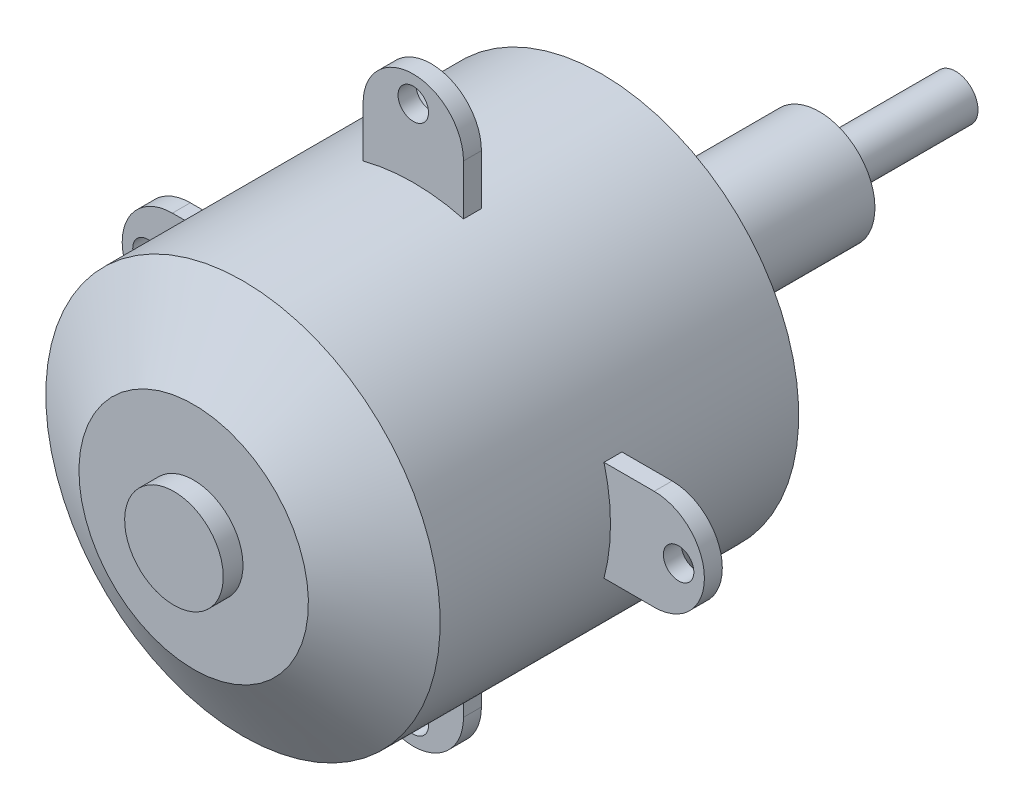
ISO-10303-21;
HEADER;
FILE_DESCRIPTION(('STEP AP214'),'2;1');
FILE_NAME('part.step','',(''),(''),'','','');
FILE_SCHEMA(('AUTOMOTIVE_DESIGN { 1 0 10303 214 1 1 1 1 }'));
ENDSEC;
DATA;
#1=APPLICATION_CONTEXT('core data for automotive mechanical design processes');
#2=APPLICATION_PROTOCOL_DEFINITION('international standard','automotive_design',2000,#1);
#3=PRODUCT_CONTEXT('',#1,'mechanical');
#4=PRODUCT('Part','Part','',(#3));
#5=PRODUCT_RELATED_PRODUCT_CATEGORY('part','',(#4));
#6=PRODUCT_DEFINITION_FORMATION('','',#4);
#7=PRODUCT_DEFINITION_CONTEXT('part definition',#1,'design');
#8=PRODUCT_DEFINITION('design','',#6,#7);
#9=PRODUCT_DEFINITION_SHAPE('','',#8);
#10=(LENGTH_UNIT() NAMED_UNIT(*) SI_UNIT(.MILLI.,.METRE.));
#11=(NAMED_UNIT(*) PLANE_ANGLE_UNIT() SI_UNIT($,.RADIAN.));
#12=(NAMED_UNIT(*) SI_UNIT($,.STERADIAN.) SOLID_ANGLE_UNIT());
#13=UNCERTAINTY_MEASURE_WITH_UNIT(LENGTH_MEASURE(1.E-05),#10,'distance_accuracy_value','');
#14=(GEOMETRIC_REPRESENTATION_CONTEXT(3) GLOBAL_UNCERTAINTY_ASSIGNED_CONTEXT((#13)) GLOBAL_UNIT_ASSIGNED_CONTEXT((#10,
#11,#12)) REPRESENTATION_CONTEXT('',''));
#15=CARTESIAN_POINT('',(0.,0.,0.));
#16=DIRECTION('',(0.,0.,1.));
#17=DIRECTION('',(1.,0.,0.));
#18=AXIS2_PLACEMENT_3D('',#15,#16,#17);
#19=CARTESIAN_POINT('',(0.,0.,16.1925));
#20=DIRECTION('',(0.,0.,1.));
#21=DIRECTION('',(0.,-1.,0.));
#22=AXIS2_PLACEMENT_3D('',#19,#20,#21);
#23=CYLINDRICAL_SURFACE('',#22,13.97);
#24=DIRECTION('',(0.,0.,1.));
#25=VECTOR('',#24,1.);
#26=CARTESIAN_POINT('',(3.556,-13.5098395253238,-0.635000000000005));
#27=LINE('',#26,#25);
#28=CARTESIAN_POINT('',(3.556,-13.5098395253238,-0.635000000000004));
#29=VERTEX_POINT('',#28);
#30=CARTESIAN_POINT('',(3.556,-13.5098395253238,0.634999999999995));
#31=VERTEX_POINT('',#30);
#32=EDGE_CURVE('E226',#29,#31,#27,.T.);
#33=ORIENTED_EDGE('',*,*,#32,.F.);
#34=CARTESIAN_POINT('',(0.,0.,-0.635));
#35=DIRECTION('',(0.,0.,1.));
#36=DIRECTION('',(-1.,0.,0.));
#37=AXIS2_PLACEMENT_3D('',#34,#35,#36);
#38=CIRCLE('',#37,13.97);
#39=CARTESIAN_POINT('',(-3.556,-13.5098395253238,-0.635000000000004));
#40=VERTEX_POINT('',#39);
#41=EDGE_CURVE('E219',#40,#29,#38,.T.);
#42=ORIENTED_EDGE('',*,*,#41,.F.);
#43=DIRECTION('',(0.,0.,1.));
#44=VECTOR('',#43,1.);
#45=CARTESIAN_POINT('',(-3.556,-13.5098395253238,-0.635000000000005));
#46=LINE('',#45,#44);
#47=CARTESIAN_POINT('',(-3.556,-13.5098395253238,0.634999999999995));
#48=VERTEX_POINT('',#47);
#49=EDGE_CURVE('E223',#40,#48,#46,.T.);
#50=ORIENTED_EDGE('',*,*,#49,.T.);
#51=CARTESIAN_POINT('',(0.,0.,0.635));
#52=DIRECTION('',(0.,0.,1.));
#53=DIRECTION('',(-1.,0.,0.));
#54=AXIS2_PLACEMENT_3D('',#51,#52,#53);
#55=CIRCLE('',#54,13.97);
#56=EDGE_CURVE('E206',#48,#31,#55,.T.);
#57=ORIENTED_EDGE('',*,*,#56,.T.);
#58=EDGE_LOOP('',(#33,#42,#50,#57));
#59=FACE_BOUND('',#58,.T.);
#60=DIRECTION('',(0.,0.,1.));
#61=VECTOR('',#60,1.);
#62=CARTESIAN_POINT('',(-3.556,13.5098395253238,-0.635));
#63=LINE('',#62,#61);
#64=CARTESIAN_POINT('',(-3.556,13.5098395253238,-0.635));
#65=VERTEX_POINT('',#64);
#66=CARTESIAN_POINT('',(-3.556,13.5098395253238,0.635));
#67=VERTEX_POINT('',#66);
#68=EDGE_CURVE('E300',#65,#67,#63,.T.);
#69=ORIENTED_EDGE('',*,*,#68,.F.);
#70=CARTESIAN_POINT('',(0.,0.,-0.635));
#71=DIRECTION('',(0.,0.,1.));
#72=DIRECTION('',(1.,0.,0.));
#73=AXIS2_PLACEMENT_3D('',#70,#71,#72);
#74=CIRCLE('',#73,13.97);
#75=CARTESIAN_POINT('',(3.556,13.5098395253238,-0.635));
#76=VERTEX_POINT('',#75);
#77=EDGE_CURVE('E293',#76,#65,#74,.T.);
#78=ORIENTED_EDGE('',*,*,#77,.F.);
#79=DIRECTION('',(0.,0.,1.));
#80=VECTOR('',#79,1.);
#81=CARTESIAN_POINT('',(3.556,13.5098395253238,-0.635));
#82=LINE('',#81,#80);
#83=CARTESIAN_POINT('',(3.556,13.5098395253238,0.635));
#84=VERTEX_POINT('',#83);
#85=EDGE_CURVE('E297',#76,#84,#82,.T.);
#86=ORIENTED_EDGE('',*,*,#85,.T.);
#87=CARTESIAN_POINT('',(0.,0.,0.635));
#88=DIRECTION('',(0.,0.,1.));
#89=DIRECTION('',(1.,0.,0.));
#90=AXIS2_PLACEMENT_3D('',#87,#88,#89);
#91=CIRCLE('',#90,13.97);
#92=EDGE_CURVE('E280',#84,#67,#91,.T.);
#93=ORIENTED_EDGE('',*,*,#92,.T.);
#94=EDGE_LOOP('',(#69,#78,#86,#93));
#95=FACE_BOUND('',#94,.T.);
#96=CARTESIAN_POINT('',(0.,0.,-12.6999999999999));
#97=DIRECTION('',(0.,0.,1.));
#98=DIRECTION('',(0.,-1.,0.));
#99=AXIS2_PLACEMENT_3D('',#96,#97,#98);
#100=CIRCLE('',#99,13.97);
#101=CARTESIAN_POINT('',(0.,-13.97,-12.6999999999999));
#102=VERTEX_POINT('',#101);
#103=EDGE_CURVE('E317',#102,#102,#100,.T.);
#104=ORIENTED_EDGE('',*,*,#103,.T.);
#105=EDGE_LOOP('',(#104));
#106=FACE_BOUND('',#105,.T.);
#107=CARTESIAN_POINT('',(0.,0.,12.7));
#108=DIRECTION('',(0.,0.,1.));
#109=DIRECTION('',(0.,-1.,0.));
#110=AXIS2_PLACEMENT_3D('',#107,#108,#109);
#111=CIRCLE('',#110,13.97);
#112=CARTESIAN_POINT('',(0.,-13.97,12.7));
#113=VERTEX_POINT('',#112);
#114=EDGE_CURVE('E314',#113,#113,#111,.T.);
#115=ORIENTED_EDGE('',*,*,#114,.F.);
#116=EDGE_LOOP('',(#115));
#117=FACE_BOUND('',#116,.T.);
#118=DIRECTION('',(0.,0.,1.));
#119=VECTOR('',#118,1.);
#120=CARTESIAN_POINT('',(-13.5098395253238,-3.55600000000005,-0.635000000000003));
#121=LINE('',#120,#119);
#122=CARTESIAN_POINT('',(-13.5098395253238,-3.55600000000005,-0.635000000000004));
#123=VERTEX_POINT('',#122);
#124=CARTESIAN_POINT('',(-13.5098395253238,-3.55600000000005,0.634999999999997));
#125=VERTEX_POINT('',#124);
#126=EDGE_CURVE('E263',#123,#125,#121,.T.);
#127=ORIENTED_EDGE('',*,*,#126,.F.);
#128=CARTESIAN_POINT('',(0.,0.,-0.635));
#129=DIRECTION('',(0.,0.,1.));
#130=DIRECTION('',(0.,1.,0.));
#131=AXIS2_PLACEMENT_3D('',#128,#129,#130);
#132=CIRCLE('',#131,13.97);
#133=CARTESIAN_POINT('',(-13.5098395253238,3.55599999999995,-0.635));
#134=VERTEX_POINT('',#133);
#135=EDGE_CURVE('E256',#134,#123,#132,.T.);
#136=ORIENTED_EDGE('',*,*,#135,.F.);
#137=DIRECTION('',(0.,0.,1.));
#138=VECTOR('',#137,1.);
#139=CARTESIAN_POINT('',(-13.5098395253238,3.55599999999995,-0.635000000000002));
#140=LINE('',#139,#138);
#141=CARTESIAN_POINT('',(-13.5098395253238,3.55599999999995,0.634999999999998));
#142=VERTEX_POINT('',#141);
#143=EDGE_CURVE('E260',#134,#142,#140,.T.);
#144=ORIENTED_EDGE('',*,*,#143,.T.);
#145=CARTESIAN_POINT('',(0.,0.,0.635));
#146=DIRECTION('',(0.,0.,1.));
#147=DIRECTION('',(0.,1.,0.));
#148=AXIS2_PLACEMENT_3D('',#145,#146,#147);
#149=CIRCLE('',#148,13.97);
#150=EDGE_CURVE('E243',#142,#125,#149,.T.);
#151=ORIENTED_EDGE('',*,*,#150,.T.);
#152=EDGE_LOOP('',(#127,#136,#144,#151));
#153=FACE_BOUND('',#152,.T.);
#154=DIRECTION('',(0.,0.,1.));
#155=VECTOR('',#154,1.);
#156=CARTESIAN_POINT('',(13.5098395253238,3.55600000000014,-0.635000000000002));
#157=LINE('',#156,#155);
#158=CARTESIAN_POINT('',(13.5098395253238,3.55600000000014,-0.635));
#159=VERTEX_POINT('',#158);
#160=CARTESIAN_POINT('',(13.5098395253238,3.55600000000014,0.634999999999998));
#161=VERTEX_POINT('',#160);
#162=EDGE_CURVE('E58',#159,#161,#157,.T.);
#163=ORIENTED_EDGE('',*,*,#162,.F.);
#164=CARTESIAN_POINT('',(0.,0.,-0.635));
#165=DIRECTION('',(0.,0.,1.));
#166=DIRECTION('',(0.,-1.,0.));
#167=AXIS2_PLACEMENT_3D('',#164,#165,#166);
#168=CIRCLE('',#167,13.97);
#169=CARTESIAN_POINT('',(13.5098395253238,-3.55599999999986,-0.635000000000004));
#170=VERTEX_POINT('',#169);
#171=EDGE_CURVE('E53',#170,#159,#168,.T.);
#172=ORIENTED_EDGE('',*,*,#171,.F.);
#173=DIRECTION('',(0.,0.,1.));
#174=VECTOR('',#173,1.);
#175=CARTESIAN_POINT('',(13.5098395253238,-3.55599999999986,-0.635000000000003));
#176=LINE('',#175,#174);
#177=CARTESIAN_POINT('',(13.5098395253238,-3.55599999999986,0.634999999999997));
#178=VERTEX_POINT('',#177);
#179=EDGE_CURVE('E190',#170,#178,#176,.T.);
#180=ORIENTED_EDGE('',*,*,#179,.T.);
#181=CARTESIAN_POINT('',(0.,0.,0.635));
#182=DIRECTION('',(0.,0.,1.));
#183=DIRECTION('',(0.,-1.,0.));
#184=AXIS2_PLACEMENT_3D('',#181,#182,#183);
#185=CIRCLE('',#184,13.97);
#186=EDGE_CURVE('E173',#178,#161,#185,.T.);
#187=ORIENTED_EDGE('',*,*,#186,.T.);
#188=EDGE_LOOP('',(#163,#172,#180,#187));
#189=FACE_BOUND('',#188,.T.);
#190=ADVANCED_FACE('F38',(#59,#95,#106,#117,#153,#189),#23,.T.);
#191=CARTESIAN_POINT('',(0.,6.98500000000002,-37.7825));
#192=DIRECTION('',(0.,0.,1.));
#193=DIRECTION('',(0.,-1.,0.));
#194=AXIS2_PLACEMENT_3D('',#191,#192,#193);
#195=PLANE('',#194);
#196=CARTESIAN_POINT('',(0.,0.,-37.7825));
#197=DIRECTION('',(0.,0.,1.));
#198=DIRECTION('',(0.,-1.,0.));
#199=AXIS2_PLACEMENT_3D('',#196,#197,#198);
#200=CIRCLE('',#199,1.58749999999999);
#201=CARTESIAN_POINT('',(0.,-1.58749999999998,-37.7825));
#202=VERTEX_POINT('',#201);
#203=EDGE_CURVE('E11',#202,#202,#200,.T.);
#204=ORIENTED_EDGE('',*,*,#203,.F.);
#205=EDGE_LOOP('',(#204));
#206=FACE_BOUND('',#205,.T.);
#207=ADVANCED_FACE('F40',(#206),#195,.F.);
#208=CARTESIAN_POINT('',(0.,0.,16.1925));
#209=DIRECTION('',(0.,0.,1.));
#210=DIRECTION('',(0.,-1.,0.));
#211=AXIS2_PLACEMENT_3D('',#208,#209,#210);
#212=CYLINDRICAL_SURFACE('',#211,1.58749999999999);
#213=ORIENTED_EDGE('',*,*,#203,.T.);
#214=EDGE_LOOP('',(#213));
#215=FACE_BOUND('',#214,.T.);
#216=CARTESIAN_POINT('',(0.,0.,-28.1305));
#217=DIRECTION('',(0.,0.,1.));
#218=DIRECTION('',(0.,-1.,0.));
#219=AXIS2_PLACEMENT_3D('',#216,#217,#218);
#220=CIRCLE('',#219,1.58749999999999);
#221=CARTESIAN_POINT('',(0.,-1.58749999999998,-28.1305));
#222=VERTEX_POINT('',#221);
#223=EDGE_CURVE('E46',#222,#222,#220,.T.);
#224=ORIENTED_EDGE('',*,*,#223,.F.);
#225=EDGE_LOOP('',(#224));
#226=FACE_BOUND('',#225,.T.);
#227=ADVANCED_FACE('F333',(#215,#226),#212,.T.);
#228=CARTESIAN_POINT('',(0.,6.98500000000002,-28.1305));
#229=DIRECTION('',(0.,0.,1.));
#230=DIRECTION('',(0.,-1.,0.));
#231=AXIS2_PLACEMENT_3D('',#228,#229,#230);
#232=PLANE('',#231);
#233=CARTESIAN_POINT('',(0.,0.,-28.1305));
#234=DIRECTION('',(0.,0.,1.));
#235=DIRECTION('',(0.,-1.,0.));
#236=AXIS2_PLACEMENT_3D('',#233,#234,#235);
#237=CIRCLE('',#236,3.93699999999999);
#238=CARTESIAN_POINT('',(0.,-3.93699999999998,-28.1305));
#239=VERTEX_POINT('',#238);
#240=EDGE_CURVE('E326',#239,#239,#237,.T.);
#241=ORIENTED_EDGE('',*,*,#240,.F.);
#242=EDGE_LOOP('',(#241));
#243=FACE_BOUND('',#242,.T.);
#244=ORIENTED_EDGE('',*,*,#223,.T.);
#245=EDGE_LOOP('',(#244));
#246=FACE_BOUND('',#245,.T.);
#247=ADVANCED_FACE('F331',(#243,#246),#232,.F.);
#248=CARTESIAN_POINT('',(0.,0.,16.1925));
#249=DIRECTION('',(0.,0.,1.));
#250=DIRECTION('',(0.,-1.,0.));
#251=AXIS2_PLACEMENT_3D('',#248,#249,#250);
#252=CYLINDRICAL_SURFACE('',#251,3.93699999999999);
#253=ORIENTED_EDGE('',*,*,#240,.T.);
#254=EDGE_LOOP('',(#253));
#255=FACE_BOUND('',#254,.T.);
#256=CARTESIAN_POINT('',(0.,0.,-16.1925));
#257=DIRECTION('',(0.,0.,1.));
#258=DIRECTION('',(0.,-1.,0.));
#259=AXIS2_PLACEMENT_3D('',#256,#257,#258);
#260=CIRCLE('',#259,3.93699999999999);
#261=CARTESIAN_POINT('',(0.,-3.93699999999999,-16.1925));
#262=VERTEX_POINT('',#261);
#263=EDGE_CURVE('E323',#262,#262,#260,.T.);
#264=ORIENTED_EDGE('',*,*,#263,.F.);
#265=EDGE_LOOP('',(#264));
#266=FACE_BOUND('',#265,.T.);
#267=ADVANCED_FACE('F340',(#255,#266),#252,.T.);
#268=CARTESIAN_POINT('',(0.,6.98500000000002,-16.1925));
#269=DIRECTION('',(0.,0.,1.));
#270=DIRECTION('',(0.,-1.,0.));
#271=AXIS2_PLACEMENT_3D('',#268,#269,#270);
#272=PLANE('',#271);
#273=CARTESIAN_POINT('',(0.,0.,-16.1924999999999));
#274=DIRECTION('',(0.,0.,1.));
#275=DIRECTION('',(0.,-1.,0.));
#276=AXIS2_PLACEMENT_3D('',#273,#274,#275);
#277=CIRCLE('',#276,8.128);
#278=CARTESIAN_POINT('',(0.,-8.12799999999999,-16.1924999999999));
#279=VERTEX_POINT('',#278);
#280=EDGE_CURVE('E320',#279,#279,#277,.T.);
#281=ORIENTED_EDGE('',*,*,#280,.F.);
#282=EDGE_LOOP('',(#281));
#283=FACE_BOUND('',#282,.T.);
#284=ORIENTED_EDGE('',*,*,#263,.T.);
#285=EDGE_LOOP('',(#284));
#286=FACE_BOUND('',#285,.T.);
#287=ADVANCED_FACE('F357',(#283,#286),#272,.F.);
#288=CARTESIAN_POINT('',(0.,0.,-16.1924999999999));
#289=DIRECTION('',(0.,0.,1.));
#290=DIRECTION('',(0.,-1.,0.));
#291=AXIS2_PLACEMENT_3D('',#288,#289,#290);
#292=CONICAL_SURFACE('',#291,8.128,1.03197682515898);
#293=ORIENTED_EDGE('',*,*,#103,.F.);
#294=EDGE_LOOP('',(#293));
#295=FACE_BOUND('',#294,.T.);
#296=ORIENTED_EDGE('',*,*,#280,.T.);
#297=EDGE_LOOP('',(#296));
#298=FACE_BOUND('',#297,.T.);
#299=ADVANCED_FACE('F354',(#295,#298),#292,.T.);
#300=CARTESIAN_POINT('',(0.,0.,16.1925));
#301=DIRECTION('',(0.,0.,-1.));
#302=DIRECTION('',(0.,1.,0.));
#303=AXIS2_PLACEMENT_3D('',#300,#301,#302);
#304=CONICAL_SURFACE('',#303,8.128,1.03197682515898);
#305=ORIENTED_EDGE('',*,*,#114,.T.);
#306=EDGE_LOOP('',(#305));
#307=FACE_BOUND('',#306,.T.);
#308=CARTESIAN_POINT('',(0.,0.,16.1925));
#309=DIRECTION('',(0.,0.,1.));
#310=DIRECTION('',(0.,-1.,0.));
#311=AXIS2_PLACEMENT_3D('',#308,#309,#310);
#312=CIRCLE('',#311,8.128);
#313=CARTESIAN_POINT('',(0.,-8.128,16.1925));
#314=VERTEX_POINT('',#313);
#315=EDGE_CURVE('E311',#314,#314,#312,.T.);
#316=ORIENTED_EDGE('',*,*,#315,.F.);
#317=EDGE_LOOP('',(#316));
#318=FACE_BOUND('',#317,.T.);
#319=ADVANCED_FACE('F352',(#307,#318),#304,.T.);
#320=CARTESIAN_POINT('',(0.,6.98500000000002,16.1925));
#321=DIRECTION('',(0.,0.,1.));
#322=DIRECTION('',(0.,-1.,0.));
#323=AXIS2_PLACEMENT_3D('',#320,#321,#322);
#324=PLANE('',#323);
#325=ORIENTED_EDGE('',*,*,#315,.T.);
#326=EDGE_LOOP('',(#325));
#327=FACE_BOUND('',#326,.T.);
#328=CARTESIAN_POINT('',(0.,0.,16.1925));
#329=DIRECTION('',(0.,0.,1.));
#330=DIRECTION('',(0.,-1.,0.));
#331=AXIS2_PLACEMENT_3D('',#328,#329,#330);
#332=CIRCLE('',#331,3.4925);
#333=CARTESIAN_POINT('',(0.,-3.4925,16.1925));
#334=VERTEX_POINT('',#333);
#335=EDGE_CURVE('E308',#334,#334,#332,.T.);
#336=ORIENTED_EDGE('',*,*,#335,.F.);
#337=EDGE_LOOP('',(#336));
#338=FACE_BOUND('',#337,.T.);
#339=ADVANCED_FACE('F386',(#327,#338),#324,.T.);
#340=CARTESIAN_POINT('',(0.,0.,16.1925));
#341=DIRECTION('',(0.,0.,1.));
#342=DIRECTION('',(0.,-1.,0.));
#343=AXIS2_PLACEMENT_3D('',#340,#341,#342);
#344=CYLINDRICAL_SURFACE('',#343,3.4925);
#345=CARTESIAN_POINT('',(0.,0.,17.5895));
#346=DIRECTION('',(0.,0.,1.));
#347=DIRECTION('',(0.,-1.,0.));
#348=AXIS2_PLACEMENT_3D('',#345,#346,#347);
#349=CIRCLE('',#348,3.4925);
#350=CARTESIAN_POINT('',(0.,-3.4925,17.5895));
#351=VERTEX_POINT('',#350);
#352=EDGE_CURVE('E299',#351,#351,#349,.T.);
#353=ORIENTED_EDGE('',*,*,#352,.F.);
#354=EDGE_LOOP('',(#353));
#355=FACE_BOUND('',#354,.T.);
#356=ORIENTED_EDGE('',*,*,#335,.T.);
#357=EDGE_LOOP('',(#356));
#358=FACE_BOUND('',#357,.T.);
#359=ADVANCED_FACE('F393',(#355,#358),#344,.T.);
#360=CARTESIAN_POINT('',(0.,6.98500000000002,17.5895));
#361=DIRECTION('',(0.,0.,1.));
#362=DIRECTION('',(0.,-1.,0.));
#363=AXIS2_PLACEMENT_3D('',#360,#361,#362);
#364=PLANE('',#363);
#365=ORIENTED_EDGE('',*,*,#352,.T.);
#366=EDGE_LOOP('',(#365));
#367=FACE_BOUND('',#366,.T.);
#368=ADVANCED_FACE('F400',(#367),#364,.T.);
#369=CARTESIAN_POINT('',(3.556,-26.977935229411,-0.635));
#370=DIRECTION('',(1.,0.,0.));
#371=DIRECTION('',(0.,1.,0.));
#372=AXIS2_PLACEMENT_3D('',#369,#370,#371);
#373=PLANE('',#372);
#374=DIRECTION('',(0.,0.,1.));
#375=VECTOR('',#374,1.);
#376=CARTESIAN_POINT('',(3.556,17.0658395253238,-0.635));
#377=LINE('',#376,#375);
#378=CARTESIAN_POINT('',(3.556,17.0658395253238,-0.635));
#379=VERTEX_POINT('',#378);
#380=CARTESIAN_POINT('',(3.556,17.0658395253238,0.635));
#381=VERTEX_POINT('',#380);
#382=EDGE_CURVE('E296',#379,#381,#377,.T.);
#383=ORIENTED_EDGE('',*,*,#382,.T.);
#384=DIRECTION('',(0.,1.,0.));
#385=VECTOR('',#384,1.);
#386=CARTESIAN_POINT('',(3.556,-26.977935229411,0.635));
#387=LINE('',#386,#385);
#388=EDGE_CURVE('E271',#84,#381,#387,.T.);
#389=ORIENTED_EDGE('',*,*,#388,.F.);
#390=ORIENTED_EDGE('',*,*,#85,.F.);
#391=DIRECTION('',(0.,1.,0.));
#392=VECTOR('',#391,1.);
#393=CARTESIAN_POINT('',(3.556,-26.977935229411,-0.635));
#394=LINE('',#393,#392);
#395=EDGE_CURVE('E285',#76,#379,#394,.T.);
#396=ORIENTED_EDGE('',*,*,#395,.T.);
#397=EDGE_LOOP('',(#383,#389,#390,#396));
#398=FACE_BOUND('',#397,.T.);
#399=ADVANCED_FACE('F408',(#398),#373,.T.);
#400=CARTESIAN_POINT('',(-3.556,-26.977935229411,-0.635));
#401=DIRECTION('',(1.,0.,0.));
#402=DIRECTION('',(0.,1.,0.));
#403=AXIS2_PLACEMENT_3D('',#400,#401,#402);
#404=PLANE('',#403);
#405=ORIENTED_EDGE('',*,*,#68,.T.);
#406=DIRECTION('',(0.,1.,0.));
#407=VECTOR('',#406,1.);
#408=CARTESIAN_POINT('',(-3.556,-26.977935229411,0.635));
#409=LINE('',#408,#407);
#410=CARTESIAN_POINT('',(-3.556,17.0658395253238,0.635));
#411=VERTEX_POINT('',#410);
#412=EDGE_CURVE('E277',#67,#411,#409,.T.);
#413=ORIENTED_EDGE('',*,*,#412,.T.);
#414=DIRECTION('',(0.,0.,1.));
#415=VECTOR('',#414,1.);
#416=CARTESIAN_POINT('',(-3.556,17.0658395253238,-0.635));
#417=LINE('',#416,#415);
#418=CARTESIAN_POINT('',(-3.556,17.0658395253238,-0.635));
#419=VERTEX_POINT('',#418);
#420=EDGE_CURVE('E303',#419,#411,#417,.T.);
#421=ORIENTED_EDGE('',*,*,#420,.F.);
#422=DIRECTION('',(0.,1.,0.));
#423=VECTOR('',#422,1.);
#424=CARTESIAN_POINT('',(-3.556,-26.977935229411,-0.635));
#425=LINE('',#424,#423);
#426=EDGE_CURVE('E291',#65,#419,#425,.T.);
#427=ORIENTED_EDGE('',*,*,#426,.F.);
#428=EDGE_LOOP('',(#405,#413,#421,#427));
#429=FACE_BOUND('',#428,.T.);
#430=ADVANCED_FACE('F416',(#429),#404,.F.);
#431=CARTESIAN_POINT('',(0.,18.796,-0.635));
#432=DIRECTION('',(0.,0.,1.));
#433=DIRECTION('',(1.,0.,0.));
#434=AXIS2_PLACEMENT_3D('',#431,#432,#433);
#435=CYLINDRICAL_SURFACE('',#434,1.0795);
#436=CARTESIAN_POINT('',(0.,18.796,-0.635));
#437=DIRECTION('',(0.,0.,1.));
#438=DIRECTION('',(1.,0.,0.));
#439=AXIS2_PLACEMENT_3D('',#436,#437,#438);
#440=CIRCLE('',#439,1.0795);
#441=CARTESIAN_POINT('',(1.0795,18.796,-0.635));
#442=VERTEX_POINT('',#441);
#443=EDGE_CURVE('E282',#442,#442,#440,.T.);
#444=ORIENTED_EDGE('',*,*,#443,.F.);
#445=EDGE_LOOP('',(#444));
#446=FACE_BOUND('',#445,.T.);
#447=CARTESIAN_POINT('',(0.,18.796,0.635));
#448=DIRECTION('',(0.,0.,1.));
#449=DIRECTION('',(1.,0.,0.));
#450=AXIS2_PLACEMENT_3D('',#447,#448,#449);
#451=CIRCLE('',#450,1.0795);
#452=CARTESIAN_POINT('',(1.0795,18.796,0.635));
#453=VERTEX_POINT('',#452);
#454=EDGE_CURVE('E262',#453,#453,#451,.T.);
#455=ORIENTED_EDGE('',*,*,#454,.T.);
#456=EDGE_LOOP('',(#455));
#457=FACE_BOUND('',#456,.T.);
#458=ADVANCED_FACE('F424',(#446,#457),#435,.F.);
#459=CARTESIAN_POINT('',(0.,17.0658395253238,-0.635));
#460=DIRECTION('',(0.,0.,1.));
#461=DIRECTION('',(1.,0.,0.));
#462=AXIS2_PLACEMENT_3D('',#459,#460,#461);
#463=CYLINDRICAL_SURFACE('',#462,3.556);
#464=ORIENTED_EDGE('',*,*,#420,.T.);
#465=CARTESIAN_POINT('',(0.,17.0658395253238,0.635));
#466=DIRECTION('',(0.,0.,1.));
#467=DIRECTION('',(1.,0.,0.));
#468=AXIS2_PLACEMENT_3D('',#465,#466,#467);
#469=CIRCLE('',#468,3.556);
#470=EDGE_CURVE('E274',#381,#411,#469,.T.);
#471=ORIENTED_EDGE('',*,*,#470,.F.);
#472=ORIENTED_EDGE('',*,*,#382,.F.);
#473=CARTESIAN_POINT('',(0.,17.0658395253238,-0.635));
#474=DIRECTION('',(0.,0.,1.));
#475=DIRECTION('',(1.,0.,0.));
#476=AXIS2_PLACEMENT_3D('',#473,#474,#475);
#477=CIRCLE('',#476,3.556);
#478=EDGE_CURVE('E288',#379,#419,#477,.T.);
#479=ORIENTED_EDGE('',*,*,#478,.T.);
#480=EDGE_LOOP('',(#464,#471,#472,#479));
#481=FACE_BOUND('',#480,.T.);
#482=ADVANCED_FACE('F432',(#481),#463,.T.);
#483=CARTESIAN_POINT('',(5.20700000000002,-26.977935229411,-0.635));
#484=DIRECTION('',(0.,0.,1.));
#485=DIRECTION('',(1.,0.,0.));
#486=AXIS2_PLACEMENT_3D('',#483,#484,#485);
#487=PLANE('',#486);
#488=ORIENTED_EDGE('',*,*,#443,.T.);
#489=EDGE_LOOP('',(#488));
#490=FACE_BOUND('',#489,.T.);
#491=ORIENTED_EDGE('',*,*,#395,.F.);
#492=ORIENTED_EDGE('',*,*,#77,.T.);
#493=ORIENTED_EDGE('',*,*,#426,.T.);
#494=ORIENTED_EDGE('',*,*,#478,.F.);
#495=EDGE_LOOP('',(#491,#492,#493,#494));
#496=FACE_BOUND('',#495,.T.);
#497=ADVANCED_FACE('F440',(#490,#496),#487,.F.);
#498=CARTESIAN_POINT('',(5.20700000000002,-26.977935229411,0.635));
#499=DIRECTION('',(0.,0.,1.));
#500=DIRECTION('',(1.,0.,0.));
#501=AXIS2_PLACEMENT_3D('',#498,#499,#500);
#502=PLANE('',#501);
#503=ORIENTED_EDGE('',*,*,#454,.F.);
#504=EDGE_LOOP('',(#503));
#505=FACE_BOUND('',#504,.T.);
#506=ORIENTED_EDGE('',*,*,#388,.T.);
#507=ORIENTED_EDGE('',*,*,#470,.T.);
#508=ORIENTED_EDGE('',*,*,#412,.F.);
#509=ORIENTED_EDGE('',*,*,#92,.F.);
#510=EDGE_LOOP('',(#506,#507,#508,#509));
#511=FACE_BOUND('',#510,.T.);
#512=ADVANCED_FACE('F448',(#505,#511),#502,.T.);
#513=CARTESIAN_POINT('',(26.977935229411,3.55600000000009,-0.634999999999994));
#514=DIRECTION('',(0.,1.,0.));
#515=DIRECTION('',(-1.,0.,0.));
#516=AXIS2_PLACEMENT_3D('',#513,#514,#515);
#517=PLANE('',#516);
#518=DIRECTION('',(0.,0.,1.));
#519=VECTOR('',#518,1.);
#520=CARTESIAN_POINT('',(-17.0658395253238,3.55599999999994,-0.635000000000003));
#521=LINE('',#520,#519);
#522=CARTESIAN_POINT('',(-17.0658395253238,3.55599999999994,-0.635000000000003));
#523=VERTEX_POINT('',#522);
#524=CARTESIAN_POINT('',(-17.0658395253238,3.55599999999994,0.634999999999998));
#525=VERTEX_POINT('',#524);
#526=EDGE_CURVE('E259',#523,#525,#521,.T.);
#527=ORIENTED_EDGE('',*,*,#526,.T.);
#528=DIRECTION('',(-1.,0.,0.));
#529=VECTOR('',#528,1.);
#530=CARTESIAN_POINT('',(26.977935229411,3.55600000000009,0.635000000000006));
#531=LINE('',#530,#529);
#532=EDGE_CURVE('E234',#142,#525,#531,.T.);
#533=ORIENTED_EDGE('',*,*,#532,.F.);
#534=ORIENTED_EDGE('',*,*,#143,.F.);
#535=DIRECTION('',(-1.,0.,0.));
#536=VECTOR('',#535,1.);
#537=CARTESIAN_POINT('',(26.977935229411,3.55600000000009,-0.634999999999994));
#538=LINE('',#537,#536);
#539=EDGE_CURVE('E248',#134,#523,#538,.T.);
#540=ORIENTED_EDGE('',*,*,#539,.T.);
#541=EDGE_LOOP('',(#527,#533,#534,#540));
#542=FACE_BOUND('',#541,.T.);
#543=ADVANCED_FACE('F456',(#542),#517,.T.);
#544=CARTESIAN_POINT('',(26.977935229411,-3.5559999999999,-0.634999999999996));
#545=DIRECTION('',(0.,1.,0.));
#546=DIRECTION('',(-1.,0.,0.));
#547=AXIS2_PLACEMENT_3D('',#544,#545,#546);
#548=PLANE('',#547);
#549=ORIENTED_EDGE('',*,*,#126,.T.);
#550=DIRECTION('',(-1.,0.,0.));
#551=VECTOR('',#550,1.);
#552=CARTESIAN_POINT('',(26.977935229411,-3.5559999999999,0.635000000000004));
#553=LINE('',#552,#551);
#554=CARTESIAN_POINT('',(-17.0658395253238,-3.55600000000006,0.634999999999996));
#555=VERTEX_POINT('',#554);
#556=EDGE_CURVE('E240',#125,#555,#553,.T.);
#557=ORIENTED_EDGE('',*,*,#556,.T.);
#558=DIRECTION('',(0.,0.,1.));
#559=VECTOR('',#558,1.);
#560=CARTESIAN_POINT('',(-17.0658395253238,-3.55600000000006,-0.635000000000004));
#561=LINE('',#560,#559);
#562=CARTESIAN_POINT('',(-17.0658395253238,-3.55600000000006,-0.635000000000004));
#563=VERTEX_POINT('',#562);
#564=EDGE_CURVE('E266',#563,#555,#561,.T.);
#565=ORIENTED_EDGE('',*,*,#564,.F.);
#566=DIRECTION('',(-1.,0.,0.));
#567=VECTOR('',#566,1.);
#568=CARTESIAN_POINT('',(26.977935229411,-3.5559999999999,-0.634999999999996));
#569=LINE('',#568,#567);
#570=EDGE_CURVE('E254',#123,#563,#569,.T.);
#571=ORIENTED_EDGE('',*,*,#570,.F.);
#572=EDGE_LOOP('',(#549,#557,#565,#571));
#573=FACE_BOUND('',#572,.T.);
#574=ADVANCED_FACE('F464',(#573),#548,.F.);
#575=CARTESIAN_POINT('',(-18.796,0.,-0.635000000000004));
#576=DIRECTION('',(0.,0.,1.));
#577=DIRECTION('',(0.,-1.,0.));
#578=AXIS2_PLACEMENT_3D('',#575,#576,#577);
#579=CYLINDRICAL_SURFACE('',#578,1.0795);
#580=CARTESIAN_POINT('',(-18.796,0.,-0.635000000000004));
#581=DIRECTION('',(0.,0.,1.));
#582=DIRECTION('',(0.,1.,0.));
#583=AXIS2_PLACEMENT_3D('',#580,#581,#582);
#584=CIRCLE('',#583,1.0795);
#585=CARTESIAN_POINT('',(-18.796,1.07949999999993,-0.635000000000003));
#586=VERTEX_POINT('',#585);
#587=EDGE_CURVE('E245',#586,#586,#584,.T.);
#588=ORIENTED_EDGE('',*,*,#587,.F.);
#589=EDGE_LOOP('',(#588));
#590=FACE_BOUND('',#589,.T.);
#591=CARTESIAN_POINT('',(-18.796,0.,0.634999999999997));
#592=DIRECTION('',(0.,0.,1.));
#593=DIRECTION('',(0.,1.,0.));
#594=AXIS2_PLACEMENT_3D('',#591,#592,#593);
#595=CIRCLE('',#594,1.0795);
#596=CARTESIAN_POINT('',(-18.796,1.07949999999993,0.634999999999997));
#597=VERTEX_POINT('',#596);
#598=EDGE_CURVE('E225',#597,#597,#595,.T.);
#599=ORIENTED_EDGE('',*,*,#598,.T.);
#600=EDGE_LOOP('',(#599));
#601=FACE_BOUND('',#600,.T.);
#602=ADVANCED_FACE('F472',(#590,#601),#579,.F.);
#603=CARTESIAN_POINT('',(-17.0658395253238,0.,-0.635000000000003));
#604=DIRECTION('',(0.,0.,1.));
#605=DIRECTION('',(0.,-1.,0.));
#606=AXIS2_PLACEMENT_3D('',#603,#604,#605);
#607=CYLINDRICAL_SURFACE('',#606,3.556);
#608=ORIENTED_EDGE('',*,*,#564,.T.);
#609=CARTESIAN_POINT('',(-17.0658395253238,0.,0.634999999999997));
#610=DIRECTION('',(0.,0.,1.));
#611=DIRECTION('',(0.,1.,0.));
#612=AXIS2_PLACEMENT_3D('',#609,#610,#611);
#613=CIRCLE('',#612,3.556);
#614=EDGE_CURVE('E237',#525,#555,#613,.T.);
#615=ORIENTED_EDGE('',*,*,#614,.F.);
#616=ORIENTED_EDGE('',*,*,#526,.F.);
#617=CARTESIAN_POINT('',(-17.0658395253238,0.,-0.635000000000003));
#618=DIRECTION('',(0.,0.,1.));
#619=DIRECTION('',(0.,1.,0.));
#620=AXIS2_PLACEMENT_3D('',#617,#618,#619);
#621=CIRCLE('',#620,3.556);
#622=EDGE_CURVE('E251',#523,#563,#621,.T.);
#623=ORIENTED_EDGE('',*,*,#622,.T.);
#624=EDGE_LOOP('',(#608,#615,#616,#623));
#625=FACE_BOUND('',#624,.T.);
#626=ADVANCED_FACE('F480',(#625),#607,.T.);
#627=CARTESIAN_POINT('',(26.977935229411,5.20700000000012,-0.634999999999994));
#628=DIRECTION('',(0.,0.,1.));
#629=DIRECTION('',(0.,1.,0.));
#630=AXIS2_PLACEMENT_3D('',#627,#628,#629);
#631=PLANE('',#630);
#632=ORIENTED_EDGE('',*,*,#587,.T.);
#633=EDGE_LOOP('',(#632));
#634=FACE_BOUND('',#633,.T.);
#635=ORIENTED_EDGE('',*,*,#539,.F.);
#636=ORIENTED_EDGE('',*,*,#135,.T.);
#637=ORIENTED_EDGE('',*,*,#570,.T.);
#638=ORIENTED_EDGE('',*,*,#622,.F.);
#639=EDGE_LOOP('',(#635,#636,#637,#638));
#640=FACE_BOUND('',#639,.T.);
#641=ADVANCED_FACE('F488',(#634,#640),#631,.F.);
#642=CARTESIAN_POINT('',(26.977935229411,5.20700000000012,0.635000000000006));
#643=DIRECTION('',(0.,0.,1.));
#644=DIRECTION('',(0.,1.,0.));
#645=AXIS2_PLACEMENT_3D('',#642,#643,#644);
#646=PLANE('',#645);
#647=ORIENTED_EDGE('',*,*,#598,.F.);
#648=EDGE_LOOP('',(#647));
#649=FACE_BOUND('',#648,.T.);
#650=ORIENTED_EDGE('',*,*,#532,.T.);
#651=ORIENTED_EDGE('',*,*,#614,.T.);
#652=ORIENTED_EDGE('',*,*,#556,.F.);
#653=ORIENTED_EDGE('',*,*,#150,.F.);
#654=EDGE_LOOP('',(#650,#651,#652,#653));
#655=FACE_BOUND('',#654,.T.);
#656=ADVANCED_FACE('F496',(#649,#655),#646,.T.);
#657=CARTESIAN_POINT('',(-3.556,26.977935229411,-0.63499999999999));
#658=DIRECTION('',(-1.,0.,0.));
#659=DIRECTION('',(0.,-1.,0.));
#660=AXIS2_PLACEMENT_3D('',#657,#658,#659);
#661=PLANE('',#660);
#662=DIRECTION('',(0.,0.,1.));
#663=VECTOR('',#662,1.);
#664=CARTESIAN_POINT('',(-3.556,-17.0658395253238,-0.635000000000006));
#665=LINE('',#664,#663);
#666=CARTESIAN_POINT('',(-3.556,-17.0658395253238,-0.635000000000006));
#667=VERTEX_POINT('',#666);
#668=CARTESIAN_POINT('',(-3.556,-17.0658395253238,0.634999999999994));
#669=VERTEX_POINT('',#668);
#670=EDGE_CURVE('E222',#667,#669,#665,.T.);
#671=ORIENTED_EDGE('',*,*,#670,.T.);
#672=DIRECTION('',(0.,-1.,0.));
#673=VECTOR('',#672,1.);
#674=CARTESIAN_POINT('',(-3.556,26.977935229411,0.63500000000001));
#675=LINE('',#674,#673);
#676=EDGE_CURVE('E197',#48,#669,#675,.T.);
#677=ORIENTED_EDGE('',*,*,#676,.F.);
#678=ORIENTED_EDGE('',*,*,#49,.F.);
#679=DIRECTION('',(0.,-1.,0.));
#680=VECTOR('',#679,1.);
#681=CARTESIAN_POINT('',(-3.556,26.977935229411,-0.63499999999999));
#682=LINE('',#681,#680);
#683=EDGE_CURVE('E211',#40,#667,#682,.T.);
#684=ORIENTED_EDGE('',*,*,#683,.T.);
#685=EDGE_LOOP('',(#671,#677,#678,#684));
#686=FACE_BOUND('',#685,.T.);
#687=ADVANCED_FACE('F504',(#686),#661,.T.);
#688=CARTESIAN_POINT('',(3.556,26.977935229411,-0.63499999999999));
#689=DIRECTION('',(-1.,0.,0.));
#690=DIRECTION('',(0.,-1.,0.));
#691=AXIS2_PLACEMENT_3D('',#688,#689,#690);
#692=PLANE('',#691);
#693=ORIENTED_EDGE('',*,*,#32,.T.);
#694=DIRECTION('',(0.,-1.,0.));
#695=VECTOR('',#694,1.);
#696=CARTESIAN_POINT('',(3.556,26.977935229411,0.63500000000001));
#697=LINE('',#696,#695);
#698=CARTESIAN_POINT('',(3.556,-17.0658395253238,0.634999999999994));
#699=VERTEX_POINT('',#698);
#700=EDGE_CURVE('E203',#31,#699,#697,.T.);
#701=ORIENTED_EDGE('',*,*,#700,.T.);
#702=DIRECTION('',(0.,0.,1.));
#703=VECTOR('',#702,1.);
#704=CARTESIAN_POINT('',(3.556,-17.0658395253238,-0.635000000000006));
#705=LINE('',#704,#703);
#706=CARTESIAN_POINT('',(3.556,-17.0658395253238,-0.635000000000006));
#707=VERTEX_POINT('',#706);
#708=EDGE_CURVE('E229',#707,#699,#705,.T.);
#709=ORIENTED_EDGE('',*,*,#708,.F.);
#710=DIRECTION('',(0.,-1.,0.));
#711=VECTOR('',#710,1.);
#712=CARTESIAN_POINT('',(3.556,26.977935229411,-0.63499999999999));
#713=LINE('',#712,#711);
#714=EDGE_CURVE('E217',#29,#707,#713,.T.);
#715=ORIENTED_EDGE('',*,*,#714,.F.);
#716=EDGE_LOOP('',(#693,#701,#709,#715));
#717=FACE_BOUND('',#716,.T.);
#718=ADVANCED_FACE('F512',(#717),#692,.F.);
#719=CARTESIAN_POINT('',(0.,-18.796,-0.635000000000007));
#720=DIRECTION('',(0.,0.,1.));
#721=DIRECTION('',(0.,-1.,0.));
#722=AXIS2_PLACEMENT_3D('',#719,#720,#721);
#723=CYLINDRICAL_SURFACE('',#722,1.0795);
#724=CARTESIAN_POINT('',(0.,-18.796,-0.635000000000007));
#725=DIRECTION('',(0.,0.,1.));
#726=DIRECTION('',(-1.,0.,0.));
#727=AXIS2_PLACEMENT_3D('',#724,#725,#726);
#728=CIRCLE('',#727,1.0795);
#729=CARTESIAN_POINT('',(-1.0795,-18.796,-0.635000000000007));
#730=VERTEX_POINT('',#729);
#731=EDGE_CURVE('E208',#730,#730,#728,.T.);
#732=ORIENTED_EDGE('',*,*,#731,.F.);
#733=EDGE_LOOP('',(#732));
#734=FACE_BOUND('',#733,.T.);
#735=CARTESIAN_POINT('',(0.,-18.796,0.634999999999993));
#736=DIRECTION('',(0.,0.,1.));
#737=DIRECTION('',(-1.,0.,0.));
#738=AXIS2_PLACEMENT_3D('',#735,#736,#737);
#739=CIRCLE('',#738,1.0795);
#740=CARTESIAN_POINT('',(-1.0795,-18.796,0.634999999999993));
#741=VERTEX_POINT('',#740);
#742=EDGE_CURVE('E192',#741,#741,#739,.T.);
#743=ORIENTED_EDGE('',*,*,#742,.T.);
#744=EDGE_LOOP('',(#743));
#745=FACE_BOUND('',#744,.T.);
#746=ADVANCED_FACE('F520',(#734,#745),#723,.F.);
#747=CARTESIAN_POINT('',(0.,-17.0658395253238,-0.635000000000006));
#748=DIRECTION('',(0.,0.,1.));
#749=DIRECTION('',(0.,-1.,0.));
#750=AXIS2_PLACEMENT_3D('',#747,#748,#749);
#751=CYLINDRICAL_SURFACE('',#750,3.556);
#752=ORIENTED_EDGE('',*,*,#708,.T.);
#753=CARTESIAN_POINT('',(0.,-17.0658395253238,0.634999999999994));
#754=DIRECTION('',(0.,0.,1.));
#755=DIRECTION('',(-1.,0.,0.));
#756=AXIS2_PLACEMENT_3D('',#753,#754,#755);
#757=CIRCLE('',#756,3.556);
#758=EDGE_CURVE('E200',#669,#699,#757,.T.);
#759=ORIENTED_EDGE('',*,*,#758,.F.);
#760=ORIENTED_EDGE('',*,*,#670,.F.);
#761=CARTESIAN_POINT('',(0.,-17.0658395253238,-0.635000000000006));
#762=DIRECTION('',(0.,0.,1.));
#763=DIRECTION('',(-1.,0.,0.));
#764=AXIS2_PLACEMENT_3D('',#761,#762,#763);
#765=CIRCLE('',#764,3.556);
#766=EDGE_CURVE('E214',#667,#707,#765,.T.);
#767=ORIENTED_EDGE('',*,*,#766,.T.);
#768=EDGE_LOOP('',(#752,#759,#760,#767));
#769=FACE_BOUND('',#768,.T.);
#770=ADVANCED_FACE('F528',(#769),#751,.T.);
#771=CARTESIAN_POINT('',(-5.20700000000002,26.977935229411,-0.63499999999999));
#772=DIRECTION('',(0.,0.,1.));
#773=DIRECTION('',(-1.,0.,0.));
#774=AXIS2_PLACEMENT_3D('',#771,#772,#773);
#775=PLANE('',#774);
#776=ORIENTED_EDGE('',*,*,#731,.T.);
#777=EDGE_LOOP('',(#776));
#778=FACE_BOUND('',#777,.T.);
#779=ORIENTED_EDGE('',*,*,#683,.F.);
#780=ORIENTED_EDGE('',*,*,#41,.T.);
#781=ORIENTED_EDGE('',*,*,#714,.T.);
#782=ORIENTED_EDGE('',*,*,#766,.F.);
#783=EDGE_LOOP('',(#779,#780,#781,#782));
#784=FACE_BOUND('',#783,.T.);
#785=ADVANCED_FACE('F536',(#778,#784),#775,.F.);
#786=CARTESIAN_POINT('',(-5.20700000000002,26.977935229411,0.63500000000001));
#787=DIRECTION('',(0.,0.,1.));
#788=DIRECTION('',(-1.,0.,0.));
#789=AXIS2_PLACEMENT_3D('',#786,#787,#788);
#790=PLANE('',#789);
#791=ORIENTED_EDGE('',*,*,#742,.F.);
#792=EDGE_LOOP('',(#791));
#793=FACE_BOUND('',#792,.T.);
#794=ORIENTED_EDGE('',*,*,#676,.T.);
#795=ORIENTED_EDGE('',*,*,#758,.T.);
#796=ORIENTED_EDGE('',*,*,#700,.F.);
#797=ORIENTED_EDGE('',*,*,#56,.F.);
#798=EDGE_LOOP('',(#794,#795,#796,#797));
#799=FACE_BOUND('',#798,.T.);
#800=ADVANCED_FACE('F544',(#793,#799),#790,.T.);
#801=CARTESIAN_POINT('',(-26.9779352294109,-3.55600000000028,-0.634999999999996));
#802=DIRECTION('',(0.,-1.,0.));
#803=DIRECTION('',(1.,0.,0.));
#804=AXIS2_PLACEMENT_3D('',#801,#802,#803);
#805=PLANE('',#804);
#806=DIRECTION('',(0.,0.,1.));
#807=VECTOR('',#806,1.);
#808=CARTESIAN_POINT('',(17.0658395253238,-3.55599999999982,-0.635000000000004));
#809=LINE('',#808,#807);
#810=CARTESIAN_POINT('',(17.0658395253238,-3.55599999999982,-0.635000000000004));
#811=VERTEX_POINT('',#810);
#812=CARTESIAN_POINT('',(17.0658395253238,-3.55599999999982,0.634999999999996));
#813=VERTEX_POINT('',#812);
#814=EDGE_CURVE('E150',#811,#813,#809,.T.);
#815=ORIENTED_EDGE('',*,*,#814,.T.);
#816=DIRECTION('',(1.,0.,0.));
#817=VECTOR('',#816,1.);
#818=CARTESIAN_POINT('',(-26.9779352294109,-3.55600000000028,0.635000000000004));
#819=LINE('',#818,#817);
#820=EDGE_CURVE('E154',#178,#813,#819,.T.);
#821=ORIENTED_EDGE('',*,*,#820,.F.);
#822=ORIENTED_EDGE('',*,*,#179,.F.);
#823=DIRECTION('',(1.,0.,0.));
#824=VECTOR('',#823,1.);
#825=CARTESIAN_POINT('',(-26.9779352294109,-3.55600000000028,-0.634999999999996));
#826=LINE('',#825,#824);
#827=EDGE_CURVE('E157',#170,#811,#826,.T.);
#828=ORIENTED_EDGE('',*,*,#827,.T.);
#829=EDGE_LOOP('',(#815,#821,#822,#828));
#830=FACE_BOUND('',#829,.T.);
#831=ADVANCED_FACE('F152',(#830),#805,.T.);
#832=CARTESIAN_POINT('',(-26.977935229411,3.55599999999972,-0.634999999999994));
#833=DIRECTION('',(0.,-1.,0.));
#834=DIRECTION('',(1.,0.,0.));
#835=AXIS2_PLACEMENT_3D('',#832,#833,#834);
#836=PLANE('',#835);
#837=ORIENTED_EDGE('',*,*,#162,.T.);
#838=DIRECTION('',(1.,0.,0.));
#839=VECTOR('',#838,1.);
#840=CARTESIAN_POINT('',(-26.977935229411,3.55599999999972,0.635000000000006));
#841=LINE('',#840,#839);
#842=CARTESIAN_POINT('',(17.0658395253238,3.55600000000018,0.634999999999998));
#843=VERTEX_POINT('',#842);
#844=EDGE_CURVE('E170',#161,#843,#841,.T.);
#845=ORIENTED_EDGE('',*,*,#844,.T.);
#846=DIRECTION('',(0.,0.,1.));
#847=VECTOR('',#846,1.);
#848=CARTESIAN_POINT('',(17.0658395253238,3.55600000000018,-0.635000000000003));
#849=LINE('',#848,#847);
#850=CARTESIAN_POINT('',(17.0658395253238,3.55600000000018,-0.635000000000003));
#851=VERTEX_POINT('',#850);
#852=EDGE_CURVE('E161',#851,#843,#849,.T.);
#853=ORIENTED_EDGE('',*,*,#852,.F.);
#854=DIRECTION('',(1.,0.,0.));
#855=VECTOR('',#854,1.);
#856=CARTESIAN_POINT('',(-26.977935229411,3.55599999999972,-0.634999999999994));
#857=LINE('',#856,#855);
#858=EDGE_CURVE('E187',#159,#851,#857,.T.);
#859=ORIENTED_EDGE('',*,*,#858,.F.);
#860=EDGE_LOOP('',(#837,#845,#853,#859));
#861=FACE_BOUND('',#860,.T.);
#862=ADVANCED_FACE('F559',(#861),#836,.F.);
#863=CARTESIAN_POINT('',(18.796,1.96994573498386E-13,-0.635000000000004));
#864=DIRECTION('',(0.,0.,1.));
#865=DIRECTION('',(1.,0.,0.));
#866=AXIS2_PLACEMENT_3D('',#863,#864,#865);
#867=CYLINDRICAL_SURFACE('',#866,1.0795);
#868=CARTESIAN_POINT('',(18.796,1.96994573498386E-13,-0.635000000000004));
#869=DIRECTION('',(0.,0.,1.));
#870=DIRECTION('',(0.,-1.,0.));
#871=AXIS2_PLACEMENT_3D('',#868,#869,#870);
#872=CIRCLE('',#871,1.0795);
#873=CARTESIAN_POINT('',(18.796,-1.0794999999998,-0.635000000000004));
#874=VERTEX_POINT('',#873);
#875=EDGE_CURVE('E181',#874,#874,#872,.T.);
#876=ORIENTED_EDGE('',*,*,#875,.F.);
#877=EDGE_LOOP('',(#876));
#878=FACE_BOUND('',#877,.T.);
#879=CARTESIAN_POINT('',(18.796,1.96760725970988E-13,0.634999999999997));
#880=DIRECTION('',(0.,0.,1.));
#881=DIRECTION('',(0.,-1.,0.));
#882=AXIS2_PLACEMENT_3D('',#879,#880,#881);
#883=CIRCLE('',#882,1.0795);
#884=CARTESIAN_POINT('',(18.796,-1.0794999999998,0.634999999999996));
#885=VERTEX_POINT('',#884);
#886=EDGE_CURVE('E174',#885,#885,#883,.T.);
#887=ORIENTED_EDGE('',*,*,#886,.T.);
#888=EDGE_LOOP('',(#887));
#889=FACE_BOUND('',#888,.T.);
#890=ADVANCED_FACE('F566',(#878,#889),#867,.F.);
#891=CARTESIAN_POINT('',(17.0658395253238,1.75836338383819E-13,-0.635000000000003));
#892=DIRECTION('',(0.,0.,1.));
#893=DIRECTION('',(1.,0.,0.));
#894=AXIS2_PLACEMENT_3D('',#891,#892,#893);
#895=CYLINDRICAL_SURFACE('',#894,3.556);
#896=ORIENTED_EDGE('',*,*,#852,.T.);
#897=CARTESIAN_POINT('',(17.0658395253238,1.7560249085642E-13,0.634999999999997));
#898=DIRECTION('',(0.,0.,1.));
#899=DIRECTION('',(0.,-1.,0.));
#900=AXIS2_PLACEMENT_3D('',#897,#898,#899);
#901=CIRCLE('',#900,3.556);
#902=EDGE_CURVE('E164',#813,#843,#901,.T.);
#903=ORIENTED_EDGE('',*,*,#902,.F.);
#904=ORIENTED_EDGE('',*,*,#814,.F.);
#905=CARTESIAN_POINT('',(17.0658395253238,1.75836338383819E-13,-0.635000000000003));
#906=DIRECTION('',(0.,0.,1.));
#907=DIRECTION('',(0.,-1.,0.));
#908=AXIS2_PLACEMENT_3D('',#905,#906,#907);
#909=CIRCLE('',#908,3.556);
#910=EDGE_CURVE('E185',#811,#851,#909,.T.);
#911=ORIENTED_EDGE('',*,*,#910,.T.);
#912=EDGE_LOOP('',(#896,#903,#904,#911));
#913=FACE_BOUND('',#912,.T.);
#914=ADVANCED_FACE('F165',(#913),#895,.T.);
#915=CARTESIAN_POINT('',(-26.9779352294109,-5.2070000000003,-0.634999999999996));
#916=DIRECTION('',(0.,0.,1.));
#917=DIRECTION('',(0.,-1.,0.));
#918=AXIS2_PLACEMENT_3D('',#915,#916,#917);
#919=PLANE('',#918);
#920=ORIENTED_EDGE('',*,*,#875,.T.);
#921=EDGE_LOOP('',(#920));
#922=FACE_BOUND('',#921,.T.);
#923=ORIENTED_EDGE('',*,*,#827,.F.);
#924=ORIENTED_EDGE('',*,*,#171,.T.);
#925=ORIENTED_EDGE('',*,*,#858,.T.);
#926=ORIENTED_EDGE('',*,*,#910,.F.);
#927=EDGE_LOOP('',(#923,#924,#925,#926));
#928=FACE_BOUND('',#927,.T.);
#929=ADVANCED_FACE('F581',(#922,#928),#919,.F.);
#930=CARTESIAN_POINT('',(-26.9779352294109,-5.2070000000003,0.635000000000004));
#931=DIRECTION('',(0.,0.,1.));
#932=DIRECTION('',(0.,-1.,0.));
#933=AXIS2_PLACEMENT_3D('',#930,#931,#932);
#934=PLANE('',#933);
#935=ORIENTED_EDGE('',*,*,#886,.F.);
#936=EDGE_LOOP('',(#935));
#937=FACE_BOUND('',#936,.T.);
#938=ORIENTED_EDGE('',*,*,#820,.T.);
#939=ORIENTED_EDGE('',*,*,#902,.T.);
#940=ORIENTED_EDGE('',*,*,#844,.F.);
#941=ORIENTED_EDGE('',*,*,#186,.F.);
#942=EDGE_LOOP('',(#938,#939,#940,#941));
#943=FACE_BOUND('',#942,.T.);
#944=ADVANCED_FACE('F172',(#937,#943),#934,.T.);
#945=CLOSED_SHELL('',(#190,#207,#227,#247,#267,#287,#299,#319,#339,#359,#368,#399,#430,#458,
#482,#497,#512,#543,#574,#602,#626,#641,#656,#687,#718,#746,#770,#785,#800,#831,#862,#890,#914,
#929,#944));
#946=MANIFOLD_SOLID_BREP('B2',#945);
#947=ADVANCED_BREP_SHAPE_REPRESENTATION('',(#18,#946),#14);
#948=SHAPE_DEFINITION_REPRESENTATION(#9,#947);
ENDSEC;
END-ISO-10303-21;
